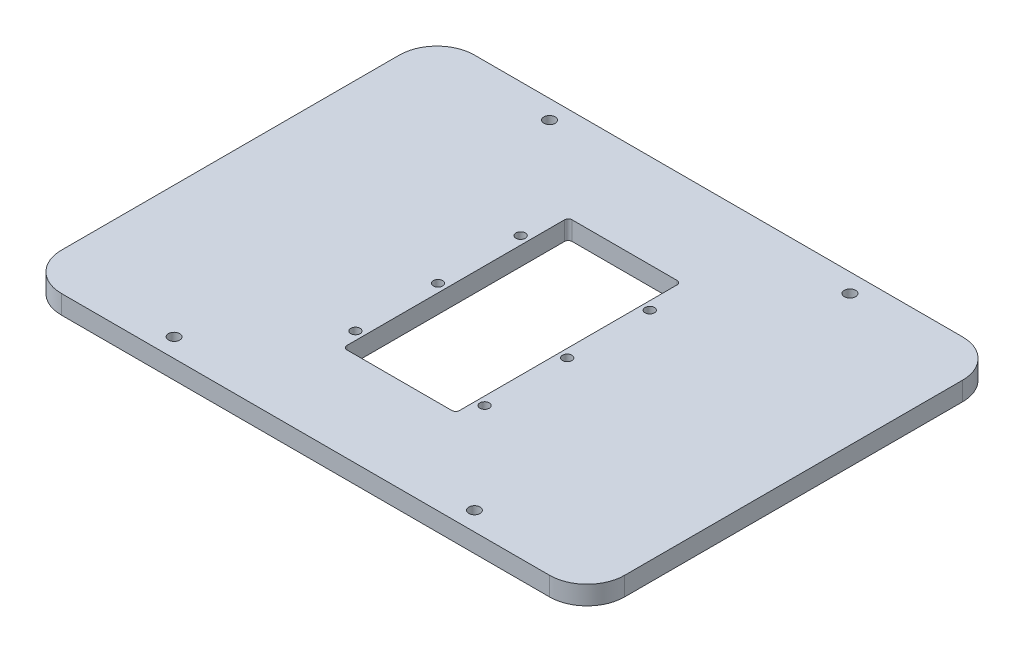
ISO-10303-21;
HEADER;
FILE_DESCRIPTION(('STEP AP214'),'2;1');
FILE_NAME('part.step','',(''),(''),'','','');
FILE_SCHEMA(('AUTOMOTIVE_DESIGN { 1 0 10303 214 1 1 1 1 }'));
ENDSEC;
DATA;
#1=APPLICATION_CONTEXT('core data for automotive mechanical design processes');
#2=APPLICATION_PROTOCOL_DEFINITION('international standard','automotive_design',2000,#1);
#3=PRODUCT_CONTEXT('',#1,'mechanical');
#4=PRODUCT('Part','Part','',(#3));
#5=PRODUCT_RELATED_PRODUCT_CATEGORY('part','',(#4));
#6=PRODUCT_DEFINITION_FORMATION('','',#4);
#7=PRODUCT_DEFINITION_CONTEXT('part definition',#1,'design');
#8=PRODUCT_DEFINITION('design','',#6,#7);
#9=PRODUCT_DEFINITION_SHAPE('','',#8);
#10=(LENGTH_UNIT() NAMED_UNIT(*) SI_UNIT(.MILLI.,.METRE.));
#11=(NAMED_UNIT(*) PLANE_ANGLE_UNIT() SI_UNIT($,.RADIAN.));
#12=(NAMED_UNIT(*) SI_UNIT($,.STERADIAN.) SOLID_ANGLE_UNIT());
#13=UNCERTAINTY_MEASURE_WITH_UNIT(LENGTH_MEASURE(1.E-05),#10,'distance_accuracy_value','');
#14=(GEOMETRIC_REPRESENTATION_CONTEXT(3) GLOBAL_UNCERTAINTY_ASSIGNED_CONTEXT((#13)) GLOBAL_UNIT_ASSIGNED_CONTEXT((#10,
#11,#12)) REPRESENTATION_CONTEXT('',''));
#15=CARTESIAN_POINT('',(0.,0.,0.));
#16=DIRECTION('',(0.,0.,1.));
#17=DIRECTION('',(1.,0.,0.));
#18=AXIS2_PLACEMENT_3D('',#15,#16,#17);
#19=CARTESIAN_POINT('',(65.,5.,45.));
#20=DIRECTION('',(0.,1.,0.));
#21=DIRECTION('',(0.,0.,1.));
#22=AXIS2_PLACEMENT_3D('',#19,#20,#21);
#23=PLANE('',#22);
#24=CARTESIAN_POINT('',(-17.2,5.,2.50000000000002));
#25=DIRECTION('',(0.,1.,0.));
#26=DIRECTION('',(0.,0.,-1.));
#27=AXIS2_PLACEMENT_3D('',#24,#25,#26);
#28=CIRCLE('',#27,1.24999999999999);
#29=CARTESIAN_POINT('',(-17.2,5.,1.25000000000003));
#30=VERTEX_POINT('',#29);
#31=EDGE_CURVE('E456',#30,#30,#28,.T.);
#32=ORIENTED_EDGE('',*,*,#31,.F.);
#33=EDGE_LOOP('',(#32));
#34=FACE_BOUND('',#33,.T.);
#35=CARTESIAN_POINT('',(17.2,5.,24.5));
#36=DIRECTION('',(0.,1.,0.));
#37=DIRECTION('',(0.,0.,1.));
#38=AXIS2_PLACEMENT_3D('',#35,#36,#37);
#39=CIRCLE('',#38,1.25);
#40=CARTESIAN_POINT('',(17.2,5.,25.75));
#41=VERTEX_POINT('',#40);
#42=EDGE_CURVE('E184',#41,#41,#39,.T.);
#43=ORIENTED_EDGE('',*,*,#42,.F.);
#44=EDGE_LOOP('',(#43));
#45=FACE_BOUND('',#44,.T.);
#46=CARTESIAN_POINT('',(17.2,5.,-19.5));
#47=DIRECTION('',(0.,1.,0.));
#48=DIRECTION('',(0.,0.,1.));
#49=AXIS2_PLACEMENT_3D('',#46,#47,#48);
#50=CIRCLE('',#49,1.25);
#51=CARTESIAN_POINT('',(17.2,5.,-18.25));
#52=VERTEX_POINT('',#51);
#53=EDGE_CURVE('E220',#52,#52,#50,.T.);
#54=ORIENTED_EDGE('',*,*,#53,.F.);
#55=EDGE_LOOP('',(#54));
#56=FACE_BOUND('',#55,.T.);
#57=CARTESIAN_POINT('',(40.,5.,-50.));
#58=DIRECTION('',(0.,1.,0.));
#59=DIRECTION('',(0.,0.,-1.));
#60=AXIS2_PLACEMENT_3D('',#57,#58,#59);
#61=CIRCLE('',#60,1.5);
#62=CARTESIAN_POINT('',(40.,5.,-51.5));
#63=VERTEX_POINT('',#62);
#64=EDGE_CURVE('E232',#63,#63,#61,.T.);
#65=ORIENTED_EDGE('',*,*,#64,.F.);
#66=EDGE_LOOP('',(#65));
#67=FACE_BOUND('',#66,.T.);
#68=CARTESIAN_POINT('',(-40.,5.,50.));
#69=DIRECTION('',(0.,1.,0.));
#70=DIRECTION('',(0.,0.,1.));
#71=AXIS2_PLACEMENT_3D('',#68,#69,#70);
#72=CIRCLE('',#71,1.5);
#73=CARTESIAN_POINT('',(-40.,5.,51.5));
#74=VERTEX_POINT('',#73);
#75=EDGE_CURVE('E244',#74,#74,#72,.T.);
#76=ORIENTED_EDGE('',*,*,#75,.F.);
#77=EDGE_LOOP('',(#76));
#78=FACE_BOUND('',#77,.T.);
#79=CARTESIAN_POINT('',(65.,5.,45.));
#80=DIRECTION('',(0.,1.,0.));
#81=DIRECTION('',(0.,0.,1.));
#82=AXIS2_PLACEMENT_3D('',#79,#80,#81);
#83=CIRCLE('',#82,9.99999999999999);
#84=CARTESIAN_POINT('',(65.,5.,55.));
#85=VERTEX_POINT('',#84);
#86=CARTESIAN_POINT('',(74.9999999999999,5.,45.));
#87=VERTEX_POINT('',#86);
#88=EDGE_CURVE('E250',#85,#87,#83,.T.);
#89=ORIENTED_EDGE('',*,*,#88,.T.);
#90=DIRECTION('',(0.,0.,-1.));
#91=VECTOR('',#90,1.);
#92=CARTESIAN_POINT('',(74.9999999999999,5.,45.));
#93=LINE('',#92,#91);
#94=CARTESIAN_POINT('',(75.,5.,-45.));
#95=VERTEX_POINT('',#94);
#96=EDGE_CURVE('E253',#87,#95,#93,.T.);
#97=ORIENTED_EDGE('',*,*,#96,.T.);
#98=CARTESIAN_POINT('',(65.,5.,-45.));
#99=DIRECTION('',(0.,1.,0.));
#100=DIRECTION('',(0.,0.,1.));
#101=AXIS2_PLACEMENT_3D('',#98,#99,#100);
#102=CIRCLE('',#101,9.99999999999999);
#103=CARTESIAN_POINT('',(65.,5.,-55.));
#104=VERTEX_POINT('',#103);
#105=EDGE_CURVE('E256',#95,#104,#102,.T.);
#106=ORIENTED_EDGE('',*,*,#105,.T.);
#107=DIRECTION('',(-1.,0.,0.));
#108=VECTOR('',#107,1.);
#109=CARTESIAN_POINT('',(65.,5.,-55.));
#110=LINE('',#109,#108);
#111=CARTESIAN_POINT('',(-65.0000000000002,5.,-55.));
#112=VERTEX_POINT('',#111);
#113=EDGE_CURVE('E258',#104,#112,#110,.T.);
#114=ORIENTED_EDGE('',*,*,#113,.T.);
#115=CARTESIAN_POINT('',(-65.0000000000002,5.,-45.));
#116=DIRECTION('',(0.,1.,0.));
#117=DIRECTION('',(0.,0.,1.));
#118=AXIS2_PLACEMENT_3D('',#115,#116,#117);
#119=CIRCLE('',#118,10.);
#120=CARTESIAN_POINT('',(-75.0000000000002,5.,-45.));
#121=VERTEX_POINT('',#120);
#122=EDGE_CURVE('E260',#112,#121,#119,.T.);
#123=ORIENTED_EDGE('',*,*,#122,.T.);
#124=DIRECTION('',(0.,0.,1.));
#125=VECTOR('',#124,1.);
#126=CARTESIAN_POINT('',(-75.0000000000002,5.,45.));
#127=LINE('',#126,#125);
#128=CARTESIAN_POINT('',(-75.0000000000002,5.,45.));
#129=VERTEX_POINT('',#128);
#130=EDGE_CURVE('E262',#121,#129,#127,.T.);
#131=ORIENTED_EDGE('',*,*,#130,.T.);
#132=CARTESIAN_POINT('',(-65.0000000000002,5.,45.));
#133=DIRECTION('',(0.,1.,0.));
#134=DIRECTION('',(0.,0.,-1.));
#135=AXIS2_PLACEMENT_3D('',#132,#133,#134);
#136=CIRCLE('',#135,10.);
#137=CARTESIAN_POINT('',(-65.0000000000002,5.,55.));
#138=VERTEX_POINT('',#137);
#139=EDGE_CURVE('E264',#129,#138,#136,.T.);
#140=ORIENTED_EDGE('',*,*,#139,.T.);
#141=DIRECTION('',(1.,0.,0.));
#142=VECTOR('',#141,1.);
#143=CARTESIAN_POINT('',(65.,5.,55.));
#144=LINE('',#143,#142);
#145=EDGE_CURVE('E266',#138,#85,#144,.T.);
#146=ORIENTED_EDGE('',*,*,#145,.T.);
#147=EDGE_LOOP('',(#89,#97,#106,#114,#123,#131,#140,#146));
#148=FACE_BOUND('',#147,.T.);
#149=CARTESIAN_POINT('',(40.,5.,50.));
#150=DIRECTION('',(0.,1.,0.));
#151=DIRECTION('',(0.,0.,1.));
#152=AXIS2_PLACEMENT_3D('',#149,#150,#151);
#153=CIRCLE('',#152,1.5);
#154=CARTESIAN_POINT('',(40.,5.,51.5));
#155=VERTEX_POINT('',#154);
#156=EDGE_CURVE('E238',#155,#155,#153,.T.);
#157=ORIENTED_EDGE('',*,*,#156,.F.);
#158=EDGE_LOOP('',(#157));
#159=FACE_BOUND('',#158,.T.);
#160=CARTESIAN_POINT('',(-40.,5.,-50.));
#161=DIRECTION('',(0.,1.,0.));
#162=DIRECTION('',(0.,0.,-1.));
#163=AXIS2_PLACEMENT_3D('',#160,#161,#162);
#164=CIRCLE('',#163,1.5);
#165=CARTESIAN_POINT('',(-40.,5.,-51.5));
#166=VERTEX_POINT('',#165);
#167=EDGE_CURVE('E226',#166,#166,#164,.T.);
#168=ORIENTED_EDGE('',*,*,#167,.F.);
#169=EDGE_LOOP('',(#168));
#170=FACE_BOUND('',#169,.T.);
#171=CARTESIAN_POINT('',(17.2,5.,2.50000000000002));
#172=DIRECTION('',(0.,1.,0.));
#173=DIRECTION('',(0.,0.,1.));
#174=AXIS2_PLACEMENT_3D('',#171,#172,#173);
#175=CIRCLE('',#174,1.25);
#176=CARTESIAN_POINT('',(17.2,5.,3.75000000000002));
#177=VERTEX_POINT('',#176);
#178=EDGE_CURVE('E214',#177,#177,#175,.T.);
#179=ORIENTED_EDGE('',*,*,#178,.F.);
#180=EDGE_LOOP('',(#179));
#181=FACE_BOUND('',#180,.T.);
#182=DIRECTION('',(0.,0.,-1.));
#183=VECTOR('',#182,1.);
#184=CARTESIAN_POINT('',(15.,5.,-29.));
#185=LINE('',#184,#183);
#186=CARTESIAN_POINT('',(15.,5.,29.));
#187=VERTEX_POINT('',#186);
#188=CARTESIAN_POINT('',(15.,5.,-29.));
#189=VERTEX_POINT('',#188);
#190=EDGE_CURVE('E154',#187,#189,#185,.T.);
#191=ORIENTED_EDGE('',*,*,#190,.F.);
#192=CARTESIAN_POINT('',(14.,5.,29.));
#193=DIRECTION('',(0.,1.,0.));
#194=DIRECTION('',(0.,0.,-1.));
#195=AXIS2_PLACEMENT_3D('',#192,#193,#194);
#196=CIRCLE('',#195,0.999999999999999);
#197=CARTESIAN_POINT('',(14.,5.,30.));
#198=VERTEX_POINT('',#197);
#199=EDGE_CURVE('E146',#198,#187,#196,.T.);
#200=ORIENTED_EDGE('',*,*,#199,.F.);
#201=DIRECTION('',(1.,0.,0.));
#202=VECTOR('',#201,1.);
#203=CARTESIAN_POINT('',(14.,5.,30.));
#204=LINE('',#203,#202);
#205=CARTESIAN_POINT('',(-14.,5.,30.));
#206=VERTEX_POINT('',#205);
#207=EDGE_CURVE('E181',#206,#198,#204,.T.);
#208=ORIENTED_EDGE('',*,*,#207,.F.);
#209=CARTESIAN_POINT('',(-14.,5.,29.));
#210=DIRECTION('',(0.,1.,0.));
#211=DIRECTION('',(0.,0.,-1.));
#212=AXIS2_PLACEMENT_3D('',#209,#210,#211);
#213=CIRCLE('',#212,0.999999999999999);
#214=CARTESIAN_POINT('',(-15.,5.,29.));
#215=VERTEX_POINT('',#214);
#216=EDGE_CURVE('E179',#215,#206,#213,.T.);
#217=ORIENTED_EDGE('',*,*,#216,.F.);
#218=DIRECTION('',(0.,0.,1.));
#219=VECTOR('',#218,1.);
#220=CARTESIAN_POINT('',(-15.,5.,-29.));
#221=LINE('',#220,#219);
#222=CARTESIAN_POINT('',(-15.,5.,-29.));
#223=VERTEX_POINT('',#222);
#224=EDGE_CURVE('E177',#223,#215,#221,.T.);
#225=ORIENTED_EDGE('',*,*,#224,.F.);
#226=CARTESIAN_POINT('',(-14.,5.,-29.));
#227=DIRECTION('',(0.,1.,0.));
#228=DIRECTION('',(0.,0.,1.));
#229=AXIS2_PLACEMENT_3D('',#226,#227,#228);
#230=CIRCLE('',#229,0.999999999999997);
#231=CARTESIAN_POINT('',(-14.,5.,-30.));
#232=VERTEX_POINT('',#231);
#233=EDGE_CURVE('E175',#232,#223,#230,.T.);
#234=ORIENTED_EDGE('',*,*,#233,.F.);
#235=DIRECTION('',(-1.,0.,0.));
#236=VECTOR('',#235,1.);
#237=CARTESIAN_POINT('',(14.,5.,-30.));
#238=LINE('',#237,#236);
#239=CARTESIAN_POINT('',(14.,5.,-30.));
#240=VERTEX_POINT('',#239);
#241=EDGE_CURVE('E170',#240,#232,#238,.T.);
#242=ORIENTED_EDGE('',*,*,#241,.F.);
#243=CARTESIAN_POINT('',(14.,5.,-29.));
#244=DIRECTION('',(0.,1.,0.));
#245=DIRECTION('',(0.,0.,-1.));
#246=AXIS2_PLACEMENT_3D('',#243,#244,#245);
#247=CIRCLE('',#246,0.999999999999997);
#248=EDGE_CURVE('E168',#189,#240,#247,.T.);
#249=ORIENTED_EDGE('',*,*,#248,.F.);
#250=EDGE_LOOP('',(#191,#200,#208,#217,#225,#234,#242,#249));
#251=FACE_BOUND('',#250,.T.);
#252=CARTESIAN_POINT('',(-17.2,5.,24.5));
#253=DIRECTION('',(0.,1.,0.));
#254=DIRECTION('',(0.,0.,-1.));
#255=AXIS2_PLACEMENT_3D('',#252,#253,#254);
#256=CIRCLE('',#255,1.24999999999999);
#257=CARTESIAN_POINT('',(-17.2,5.,23.25));
#258=VERTEX_POINT('',#257);
#259=EDGE_CURVE('E462',#258,#258,#256,.T.);
#260=ORIENTED_EDGE('',*,*,#259,.F.);
#261=EDGE_LOOP('',(#260));
#262=FACE_BOUND('',#261,.T.);
#263=CARTESIAN_POINT('',(-17.2,5.,-19.5));
#264=DIRECTION('',(0.,1.,0.));
#265=DIRECTION('',(0.,0.,-1.));
#266=AXIS2_PLACEMENT_3D('',#263,#264,#265);
#267=CIRCLE('',#266,1.24999999999999);
#268=CARTESIAN_POINT('',(-17.2,5.,-20.75));
#269=VERTEX_POINT('',#268);
#270=EDGE_CURVE('E447',#269,#269,#267,.T.);
#271=ORIENTED_EDGE('',*,*,#270,.F.);
#272=EDGE_LOOP('',(#271));
#273=FACE_BOUND('',#272,.T.);
#274=ADVANCED_FACE('F33',(#34,#45,#56,#67,#78,#148,#159,#170,#181,#251,#262,#273),#23,.T.);
#275=CARTESIAN_POINT('',(65.,0.,45.));
#276=DIRECTION('',(0.,1.,0.));
#277=DIRECTION('',(0.,0.,1.));
#278=AXIS2_PLACEMENT_3D('',#275,#276,#277);
#279=PLANE('',#278);
#280=CARTESIAN_POINT('',(17.2,0.,2.50000000000002));
#281=DIRECTION('',(0.,1.,0.));
#282=DIRECTION('',(0.,0.,1.));
#283=AXIS2_PLACEMENT_3D('',#280,#281,#282);
#284=CIRCLE('',#283,1.25);
#285=CARTESIAN_POINT('',(17.2,0.,3.75000000000002));
#286=VERTEX_POINT('',#285);
#287=EDGE_CURVE('E162',#286,#286,#284,.T.);
#288=ORIENTED_EDGE('',*,*,#287,.T.);
#289=EDGE_LOOP('',(#288));
#290=FACE_BOUND('',#289,.T.);
#291=CARTESIAN_POINT('',(17.2,0.,-19.5));
#292=DIRECTION('',(0.,1.,0.));
#293=DIRECTION('',(0.,0.,1.));
#294=AXIS2_PLACEMENT_3D('',#291,#292,#293);
#295=CIRCLE('',#294,1.25);
#296=CARTESIAN_POINT('',(17.2,0.,-18.25));
#297=VERTEX_POINT('',#296);
#298=EDGE_CURVE('E217',#297,#297,#295,.T.);
#299=ORIENTED_EDGE('',*,*,#298,.T.);
#300=EDGE_LOOP('',(#299));
#301=FACE_BOUND('',#300,.T.);
#302=CARTESIAN_POINT('',(-40.,0.,-50.));
#303=DIRECTION('',(0.,1.,0.));
#304=DIRECTION('',(0.,0.,-1.));
#305=AXIS2_PLACEMENT_3D('',#302,#303,#304);
#306=CIRCLE('',#305,1.5);
#307=CARTESIAN_POINT('',(-40.,0.,-51.5));
#308=VERTEX_POINT('',#307);
#309=EDGE_CURVE('E223',#308,#308,#306,.T.);
#310=ORIENTED_EDGE('',*,*,#309,.T.);
#311=EDGE_LOOP('',(#310));
#312=FACE_BOUND('',#311,.T.);
#313=CARTESIAN_POINT('',(40.,0.,-50.));
#314=DIRECTION('',(0.,1.,0.));
#315=DIRECTION('',(0.,0.,-1.));
#316=AXIS2_PLACEMENT_3D('',#313,#314,#315);
#317=CIRCLE('',#316,1.5);
#318=CARTESIAN_POINT('',(40.,0.,-51.5));
#319=VERTEX_POINT('',#318);
#320=EDGE_CURVE('E229',#319,#319,#317,.T.);
#321=ORIENTED_EDGE('',*,*,#320,.T.);
#322=EDGE_LOOP('',(#321));
#323=FACE_BOUND('',#322,.T.);
#324=CARTESIAN_POINT('',(40.,0.,50.));
#325=DIRECTION('',(0.,1.,0.));
#326=DIRECTION('',(0.,0.,1.));
#327=AXIS2_PLACEMENT_3D('',#324,#325,#326);
#328=CIRCLE('',#327,1.5);
#329=CARTESIAN_POINT('',(40.,0.,51.5));
#330=VERTEX_POINT('',#329);
#331=EDGE_CURVE('E235',#330,#330,#328,.T.);
#332=ORIENTED_EDGE('',*,*,#331,.T.);
#333=EDGE_LOOP('',(#332));
#334=FACE_BOUND('',#333,.T.);
#335=CARTESIAN_POINT('',(-40.,0.,50.));
#336=DIRECTION('',(0.,1.,0.));
#337=DIRECTION('',(0.,0.,1.));
#338=AXIS2_PLACEMENT_3D('',#335,#336,#337);
#339=CIRCLE('',#338,1.5);
#340=CARTESIAN_POINT('',(-40.,0.,51.5));
#341=VERTEX_POINT('',#340);
#342=EDGE_CURVE('E241',#341,#341,#339,.T.);
#343=ORIENTED_EDGE('',*,*,#342,.T.);
#344=EDGE_LOOP('',(#343));
#345=FACE_BOUND('',#344,.T.);
#346=CARTESIAN_POINT('',(65.,0.,45.));
#347=DIRECTION('',(0.,1.,0.));
#348=DIRECTION('',(0.,0.,1.));
#349=AXIS2_PLACEMENT_3D('',#346,#347,#348);
#350=CIRCLE('',#349,9.99999999999999);
#351=CARTESIAN_POINT('',(65.,0.,55.));
#352=VERTEX_POINT('',#351);
#353=CARTESIAN_POINT('',(74.9999999999999,0.,45.));
#354=VERTEX_POINT('',#353);
#355=EDGE_CURVE('E247',#352,#354,#350,.T.);
#356=ORIENTED_EDGE('',*,*,#355,.F.);
#357=DIRECTION('',(1.,0.,0.));
#358=VECTOR('',#357,1.);
#359=CARTESIAN_POINT('',(65.,0.,55.));
#360=LINE('',#359,#358);
#361=CARTESIAN_POINT('',(-65.0000000000002,0.,55.));
#362=VERTEX_POINT('',#361);
#363=EDGE_CURVE('E254',#362,#352,#360,.T.);
#364=ORIENTED_EDGE('',*,*,#363,.F.);
#365=CARTESIAN_POINT('',(-65.0000000000002,0.,45.));
#366=DIRECTION('',(0.,1.,0.));
#367=DIRECTION('',(0.,0.,-1.));
#368=AXIS2_PLACEMENT_3D('',#365,#366,#367);
#369=CIRCLE('',#368,10.);
#370=CARTESIAN_POINT('',(-75.0000000000002,0.,45.));
#371=VERTEX_POINT('',#370);
#372=EDGE_CURVE('E281',#371,#362,#369,.T.);
#373=ORIENTED_EDGE('',*,*,#372,.F.);
#374=DIRECTION('',(0.,0.,1.));
#375=VECTOR('',#374,1.);
#376=CARTESIAN_POINT('',(-75.0000000000002,0.,45.));
#377=LINE('',#376,#375);
#378=CARTESIAN_POINT('',(-75.0000000000002,0.,-45.));
#379=VERTEX_POINT('',#378);
#380=EDGE_CURVE('E279',#379,#371,#377,.T.);
#381=ORIENTED_EDGE('',*,*,#380,.F.);
#382=CARTESIAN_POINT('',(-65.0000000000002,0.,-45.));
#383=DIRECTION('',(0.,1.,0.));
#384=DIRECTION('',(0.,0.,1.));
#385=AXIS2_PLACEMENT_3D('',#382,#383,#384);
#386=CIRCLE('',#385,10.);
#387=CARTESIAN_POINT('',(-65.0000000000002,0.,-55.));
#388=VERTEX_POINT('',#387);
#389=EDGE_CURVE('E277',#388,#379,#386,.T.);
#390=ORIENTED_EDGE('',*,*,#389,.F.);
#391=DIRECTION('',(-1.,0.,0.));
#392=VECTOR('',#391,1.);
#393=CARTESIAN_POINT('',(65.,0.,-55.));
#394=LINE('',#393,#392);
#395=CARTESIAN_POINT('',(65.,0.,-55.));
#396=VERTEX_POINT('',#395);
#397=EDGE_CURVE('E275',#396,#388,#394,.T.);
#398=ORIENTED_EDGE('',*,*,#397,.F.);
#399=CARTESIAN_POINT('',(65.,0.,-45.));
#400=DIRECTION('',(0.,1.,0.));
#401=DIRECTION('',(0.,0.,1.));
#402=AXIS2_PLACEMENT_3D('',#399,#400,#401);
#403=CIRCLE('',#402,9.99999999999999);
#404=CARTESIAN_POINT('',(75.,0.,-45.));
#405=VERTEX_POINT('',#404);
#406=EDGE_CURVE('E273',#405,#396,#403,.T.);
#407=ORIENTED_EDGE('',*,*,#406,.F.);
#408=DIRECTION('',(0.,0.,-1.));
#409=VECTOR('',#408,1.);
#410=CARTESIAN_POINT('',(74.9999999999999,0.,45.));
#411=LINE('',#410,#409);
#412=EDGE_CURVE('E271',#354,#405,#411,.T.);
#413=ORIENTED_EDGE('',*,*,#412,.F.);
#414=EDGE_LOOP('',(#356,#364,#373,#381,#390,#398,#407,#413));
#415=FACE_BOUND('',#414,.T.);
#416=CARTESIAN_POINT('',(14.,0.,29.));
#417=DIRECTION('',(0.,1.,0.));
#418=DIRECTION('',(0.,0.,-1.));
#419=AXIS2_PLACEMENT_3D('',#416,#417,#418);
#420=CIRCLE('',#419,0.999999999999999);
#421=CARTESIAN_POINT('',(14.,0.,30.));
#422=VERTEX_POINT('',#421);
#423=CARTESIAN_POINT('',(15.,0.,29.));
#424=VERTEX_POINT('',#423);
#425=EDGE_CURVE('E56',#422,#424,#420,.T.);
#426=ORIENTED_EDGE('',*,*,#425,.T.);
#427=DIRECTION('',(0.,0.,-1.));
#428=VECTOR('',#427,1.);
#429=CARTESIAN_POINT('',(15.,0.,-29.));
#430=LINE('',#429,#428);
#431=CARTESIAN_POINT('',(15.,0.,-29.));
#432=VERTEX_POINT('',#431);
#433=EDGE_CURVE('E161',#424,#432,#430,.T.);
#434=ORIENTED_EDGE('',*,*,#433,.T.);
#435=CARTESIAN_POINT('',(14.,0.,-29.));
#436=DIRECTION('',(0.,1.,0.));
#437=DIRECTION('',(0.,0.,-1.));
#438=AXIS2_PLACEMENT_3D('',#435,#436,#437);
#439=CIRCLE('',#438,0.999999999999997);
#440=CARTESIAN_POINT('',(14.,0.,-30.));
#441=VERTEX_POINT('',#440);
#442=EDGE_CURVE('E186',#432,#441,#439,.T.);
#443=ORIENTED_EDGE('',*,*,#442,.T.);
#444=DIRECTION('',(-1.,0.,0.));
#445=VECTOR('',#444,1.);
#446=CARTESIAN_POINT('',(14.,0.,-30.));
#447=LINE('',#446,#445);
#448=CARTESIAN_POINT('',(-14.,0.,-30.));
#449=VERTEX_POINT('',#448);
#450=EDGE_CURVE('E189',#441,#449,#447,.T.);
#451=ORIENTED_EDGE('',*,*,#450,.T.);
#452=CARTESIAN_POINT('',(-14.,0.,-29.));
#453=DIRECTION('',(0.,1.,0.));
#454=DIRECTION('',(0.,0.,1.));
#455=AXIS2_PLACEMENT_3D('',#452,#453,#454);
#456=CIRCLE('',#455,0.999999999999997);
#457=CARTESIAN_POINT('',(-15.,0.,-29.));
#458=VERTEX_POINT('',#457);
#459=EDGE_CURVE('E192',#449,#458,#456,.T.);
#460=ORIENTED_EDGE('',*,*,#459,.T.);
#461=DIRECTION('',(0.,0.,1.));
#462=VECTOR('',#461,1.);
#463=CARTESIAN_POINT('',(-15.,0.,-29.));
#464=LINE('',#463,#462);
#465=CARTESIAN_POINT('',(-15.,0.,29.));
#466=VERTEX_POINT('',#465);
#467=EDGE_CURVE('E195',#458,#466,#464,.T.);
#468=ORIENTED_EDGE('',*,*,#467,.T.);
#469=CARTESIAN_POINT('',(-14.,0.,29.));
#470=DIRECTION('',(0.,1.,0.));
#471=DIRECTION('',(0.,0.,-1.));
#472=AXIS2_PLACEMENT_3D('',#469,#470,#471);
#473=CIRCLE('',#472,0.999999999999999);
#474=CARTESIAN_POINT('',(-14.,0.,30.));
#475=VERTEX_POINT('',#474);
#476=EDGE_CURVE('E198',#466,#475,#473,.T.);
#477=ORIENTED_EDGE('',*,*,#476,.T.);
#478=DIRECTION('',(1.,0.,0.));
#479=VECTOR('',#478,1.);
#480=CARTESIAN_POINT('',(14.,0.,30.));
#481=LINE('',#480,#479);
#482=EDGE_CURVE('E155',#475,#422,#481,.T.);
#483=ORIENTED_EDGE('',*,*,#482,.T.);
#484=EDGE_LOOP('',(#426,#434,#443,#451,#460,#468,#477,#483));
#485=FACE_BOUND('',#484,.T.);
#486=CARTESIAN_POINT('',(17.2,0.,24.5));
#487=DIRECTION('',(0.,1.,0.));
#488=DIRECTION('',(0.,0.,1.));
#489=AXIS2_PLACEMENT_3D('',#486,#487,#488);
#490=CIRCLE('',#489,1.25);
#491=CARTESIAN_POINT('',(17.2,0.,25.75));
#492=VERTEX_POINT('',#491);
#493=EDGE_CURVE('E465',#492,#492,#490,.T.);
#494=ORIENTED_EDGE('',*,*,#493,.T.);
#495=EDGE_LOOP('',(#494));
#496=FACE_BOUND('',#495,.T.);
#497=CARTESIAN_POINT('',(-17.2,0.,24.5));
#498=DIRECTION('',(0.,1.,0.));
#499=DIRECTION('',(0.,0.,-1.));
#500=AXIS2_PLACEMENT_3D('',#497,#498,#499);
#501=CIRCLE('',#500,1.24999999999999);
#502=CARTESIAN_POINT('',(-17.2,0.,23.25));
#503=VERTEX_POINT('',#502);
#504=EDGE_CURVE('E459',#503,#503,#501,.T.);
#505=ORIENTED_EDGE('',*,*,#504,.T.);
#506=EDGE_LOOP('',(#505));
#507=FACE_BOUND('',#506,.T.);
#508=CARTESIAN_POINT('',(-17.2,0.,2.50000000000002));
#509=DIRECTION('',(0.,1.,0.));
#510=DIRECTION('',(0.,0.,-1.));
#511=AXIS2_PLACEMENT_3D('',#508,#509,#510);
#512=CIRCLE('',#511,1.24999999999999);
#513=CARTESIAN_POINT('',(-17.2,0.,1.25000000000003));
#514=VERTEX_POINT('',#513);
#515=EDGE_CURVE('E453',#514,#514,#512,.T.);
#516=ORIENTED_EDGE('',*,*,#515,.T.);
#517=EDGE_LOOP('',(#516));
#518=FACE_BOUND('',#517,.T.);
#519=CARTESIAN_POINT('',(-17.2,0.,-19.5));
#520=DIRECTION('',(0.,1.,0.));
#521=DIRECTION('',(0.,0.,-1.));
#522=AXIS2_PLACEMENT_3D('',#519,#520,#521);
#523=CIRCLE('',#522,1.24999999999999);
#524=CARTESIAN_POINT('',(-17.2,0.,-20.75));
#525=VERTEX_POINT('',#524);
#526=EDGE_CURVE('E450',#525,#525,#523,.T.);
#527=ORIENTED_EDGE('',*,*,#526,.T.);
#528=EDGE_LOOP('',(#527));
#529=FACE_BOUND('',#528,.T.);
#530=ADVANCED_FACE('F311',(#290,#301,#312,#323,#334,#345,#415,#485,#496,#507,#518,#529),#279,.F.);
#531=CARTESIAN_POINT('',(65.,5.,45.));
#532=DIRECTION('',(0.,-1.,0.));
#533=DIRECTION('',(0.,0.,-1.));
#534=AXIS2_PLACEMENT_3D('',#531,#532,#533);
#535=CYLINDRICAL_SURFACE('',#534,9.99999999999999);
#536=ORIENTED_EDGE('',*,*,#355,.T.);
#537=DIRECTION('',(0.,-1.,0.));
#538=VECTOR('',#537,1.);
#539=CARTESIAN_POINT('',(74.9999999999999,5.,45.));
#540=LINE('',#539,#538);
#541=EDGE_CURVE('E11',#87,#354,#540,.T.);
#542=ORIENTED_EDGE('',*,*,#541,.F.);
#543=ORIENTED_EDGE('',*,*,#88,.F.);
#544=DIRECTION('',(0.,-1.,0.));
#545=VECTOR('',#544,1.);
#546=CARTESIAN_POINT('',(65.,5.,55.));
#547=LINE('',#546,#545);
#548=EDGE_CURVE('E268',#85,#352,#547,.T.);
#549=ORIENTED_EDGE('',*,*,#548,.T.);
#550=EDGE_LOOP('',(#536,#542,#543,#549));
#551=FACE_BOUND('',#550,.T.);
#552=ADVANCED_FACE('F35',(#551),#535,.T.);
#553=CARTESIAN_POINT('',(74.9999999999999,5.,45.));
#554=DIRECTION('',(-1.,0.,0.));
#555=DIRECTION('',(0.,0.,1.));
#556=AXIS2_PLACEMENT_3D('',#553,#554,#555);
#557=PLANE('',#556);
#558=ORIENTED_EDGE('',*,*,#412,.T.);
#559=DIRECTION('',(0.,-1.,0.));
#560=VECTOR('',#559,1.);
#561=CARTESIAN_POINT('',(75.,5.,-45.));
#562=LINE('',#561,#560);
#563=EDGE_CURVE('E41',#95,#405,#562,.T.);
#564=ORIENTED_EDGE('',*,*,#563,.F.);
#565=ORIENTED_EDGE('',*,*,#96,.F.);
#566=ORIENTED_EDGE('',*,*,#541,.T.);
#567=EDGE_LOOP('',(#558,#564,#565,#566));
#568=FACE_BOUND('',#567,.T.);
#569=ADVANCED_FACE('F329',(#568),#557,.F.);
#570=CARTESIAN_POINT('',(65.,5.,-45.));
#571=DIRECTION('',(0.,-1.,0.));
#572=DIRECTION('',(0.,0.,-1.));
#573=AXIS2_PLACEMENT_3D('',#570,#571,#572);
#574=CYLINDRICAL_SURFACE('',#573,9.99999999999999);
#575=ORIENTED_EDGE('',*,*,#406,.T.);
#576=DIRECTION('',(0.,-1.,0.));
#577=VECTOR('',#576,1.);
#578=CARTESIAN_POINT('',(65.,5.,-55.));
#579=LINE('',#578,#577);
#580=EDGE_CURVE('E298',#104,#396,#579,.T.);
#581=ORIENTED_EDGE('',*,*,#580,.F.);
#582=ORIENTED_EDGE('',*,*,#105,.F.);
#583=ORIENTED_EDGE('',*,*,#563,.T.);
#584=EDGE_LOOP('',(#575,#581,#582,#583));
#585=FACE_BOUND('',#584,.T.);
#586=ADVANCED_FACE('F305',(#585),#574,.T.);
#587=CARTESIAN_POINT('',(65.,5.,-55.));
#588=DIRECTION('',(0.,0.,1.));
#589=DIRECTION('',(1.,0.,0.));
#590=AXIS2_PLACEMENT_3D('',#587,#588,#589);
#591=PLANE('',#590);
#592=ORIENTED_EDGE('',*,*,#397,.T.);
#593=DIRECTION('',(0.,-1.,0.));
#594=VECTOR('',#593,1.);
#595=CARTESIAN_POINT('',(-65.0000000000002,5.,-55.));
#596=LINE('',#595,#594);
#597=EDGE_CURVE('E295',#112,#388,#596,.T.);
#598=ORIENTED_EDGE('',*,*,#597,.F.);
#599=ORIENTED_EDGE('',*,*,#113,.F.);
#600=ORIENTED_EDGE('',*,*,#580,.T.);
#601=EDGE_LOOP('',(#592,#598,#599,#600));
#602=FACE_BOUND('',#601,.T.);
#603=ADVANCED_FACE('F317',(#602),#591,.F.);
#604=CARTESIAN_POINT('',(-65.0000000000002,5.,-45.));
#605=DIRECTION('',(0.,-1.,0.));
#606=DIRECTION('',(0.,0.,-1.));
#607=AXIS2_PLACEMENT_3D('',#604,#605,#606);
#608=CYLINDRICAL_SURFACE('',#607,10.);
#609=ORIENTED_EDGE('',*,*,#389,.T.);
#610=DIRECTION('',(0.,-1.,0.));
#611=VECTOR('',#610,1.);
#612=CARTESIAN_POINT('',(-75.0000000000002,5.,-45.));
#613=LINE('',#612,#611);
#614=EDGE_CURVE('E292',#121,#379,#613,.T.);
#615=ORIENTED_EDGE('',*,*,#614,.F.);
#616=ORIENTED_EDGE('',*,*,#122,.F.);
#617=ORIENTED_EDGE('',*,*,#597,.T.);
#618=EDGE_LOOP('',(#609,#615,#616,#617));
#619=FACE_BOUND('',#618,.T.);
#620=ADVANCED_FACE('F321',(#619),#608,.T.);
#621=CARTESIAN_POINT('',(-75.0000000000002,5.,45.));
#622=DIRECTION('',(1.,0.,0.));
#623=DIRECTION('',(0.,0.,-1.));
#624=AXIS2_PLACEMENT_3D('',#621,#622,#623);
#625=PLANE('',#624);
#626=ORIENTED_EDGE('',*,*,#380,.T.);
#627=DIRECTION('',(0.,-1.,0.));
#628=VECTOR('',#627,1.);
#629=CARTESIAN_POINT('',(-75.0000000000002,5.,45.));
#630=LINE('',#629,#628);
#631=EDGE_CURVE('E289',#129,#371,#630,.T.);
#632=ORIENTED_EDGE('',*,*,#631,.F.);
#633=ORIENTED_EDGE('',*,*,#130,.F.);
#634=ORIENTED_EDGE('',*,*,#614,.T.);
#635=EDGE_LOOP('',(#626,#632,#633,#634));
#636=FACE_BOUND('',#635,.T.);
#637=ADVANCED_FACE('F342',(#636),#625,.F.);
#638=CARTESIAN_POINT('',(-65.0000000000002,5.,45.));
#639=DIRECTION('',(0.,-1.,0.));
#640=DIRECTION('',(0.,0.,-1.));
#641=AXIS2_PLACEMENT_3D('',#638,#639,#640);
#642=CYLINDRICAL_SURFACE('',#641,10.);
#643=ORIENTED_EDGE('',*,*,#372,.T.);
#644=DIRECTION('',(0.,-1.,0.));
#645=VECTOR('',#644,1.);
#646=CARTESIAN_POINT('',(-65.0000000000002,5.,55.));
#647=LINE('',#646,#645);
#648=EDGE_CURVE('E286',#138,#362,#647,.T.);
#649=ORIENTED_EDGE('',*,*,#648,.F.);
#650=ORIENTED_EDGE('',*,*,#139,.F.);
#651=ORIENTED_EDGE('',*,*,#631,.T.);
#652=EDGE_LOOP('',(#643,#649,#650,#651));
#653=FACE_BOUND('',#652,.T.);
#654=ADVANCED_FACE('F340',(#653),#642,.T.);
#655=CARTESIAN_POINT('',(65.,5.,55.));
#656=DIRECTION('',(0.,0.,-1.));
#657=DIRECTION('',(-1.,0.,0.));
#658=AXIS2_PLACEMENT_3D('',#655,#656,#657);
#659=PLANE('',#658);
#660=ORIENTED_EDGE('',*,*,#363,.T.);
#661=ORIENTED_EDGE('',*,*,#548,.F.);
#662=ORIENTED_EDGE('',*,*,#145,.F.);
#663=ORIENTED_EDGE('',*,*,#648,.T.);
#664=EDGE_LOOP('',(#660,#661,#662,#663));
#665=FACE_BOUND('',#664,.T.);
#666=ADVANCED_FACE('F335',(#665),#659,.F.);
#667=CARTESIAN_POINT('',(-40.,5.,50.));
#668=DIRECTION('',(0.,-1.,0.));
#669=DIRECTION('',(0.,0.,-1.));
#670=AXIS2_PLACEMENT_3D('',#667,#668,#669);
#671=CYLINDRICAL_SURFACE('',#670,1.5);
#672=ORIENTED_EDGE('',*,*,#75,.T.);
#673=EDGE_LOOP('',(#672));
#674=FACE_BOUND('',#673,.T.);
#675=ORIENTED_EDGE('',*,*,#342,.F.);
#676=EDGE_LOOP('',(#675));
#677=FACE_BOUND('',#676,.T.);
#678=ADVANCED_FACE('F362',(#674,#677),#671,.F.);
#679=CARTESIAN_POINT('',(40.,5.,50.));
#680=DIRECTION('',(0.,-1.,0.));
#681=DIRECTION('',(0.,0.,-1.));
#682=AXIS2_PLACEMENT_3D('',#679,#680,#681);
#683=CYLINDRICAL_SURFACE('',#682,1.5);
#684=ORIENTED_EDGE('',*,*,#156,.T.);
#685=EDGE_LOOP('',(#684));
#686=FACE_BOUND('',#685,.T.);
#687=ORIENTED_EDGE('',*,*,#331,.F.);
#688=EDGE_LOOP('',(#687));
#689=FACE_BOUND('',#688,.T.);
#690=ADVANCED_FACE('F369',(#686,#689),#683,.F.);
#691=CARTESIAN_POINT('',(40.,5.,-50.));
#692=DIRECTION('',(0.,-1.,0.));
#693=DIRECTION('',(0.,0.,-1.));
#694=AXIS2_PLACEMENT_3D('',#691,#692,#693);
#695=CYLINDRICAL_SURFACE('',#694,1.5);
#696=ORIENTED_EDGE('',*,*,#64,.T.);
#697=EDGE_LOOP('',(#696));
#698=FACE_BOUND('',#697,.T.);
#699=ORIENTED_EDGE('',*,*,#320,.F.);
#700=EDGE_LOOP('',(#699));
#701=FACE_BOUND('',#700,.T.);
#702=ADVANCED_FACE('F374',(#698,#701),#695,.F.);
#703=CARTESIAN_POINT('',(-40.,5.,-50.));
#704=DIRECTION('',(0.,-1.,0.));
#705=DIRECTION('',(0.,0.,-1.));
#706=AXIS2_PLACEMENT_3D('',#703,#704,#705);
#707=CYLINDRICAL_SURFACE('',#706,1.5);
#708=ORIENTED_EDGE('',*,*,#167,.T.);
#709=EDGE_LOOP('',(#708));
#710=FACE_BOUND('',#709,.T.);
#711=ORIENTED_EDGE('',*,*,#309,.F.);
#712=EDGE_LOOP('',(#711));
#713=FACE_BOUND('',#712,.T.);
#714=ADVANCED_FACE('F384',(#710,#713),#707,.F.);
#715=CARTESIAN_POINT('',(17.2,5.,-19.5));
#716=DIRECTION('',(0.,-1.,0.));
#717=DIRECTION('',(0.,0.,-1.));
#718=AXIS2_PLACEMENT_3D('',#715,#716,#717);
#719=CYLINDRICAL_SURFACE('',#718,1.25);
#720=ORIENTED_EDGE('',*,*,#53,.T.);
#721=EDGE_LOOP('',(#720));
#722=FACE_BOUND('',#721,.T.);
#723=ORIENTED_EDGE('',*,*,#298,.F.);
#724=EDGE_LOOP('',(#723));
#725=FACE_BOUND('',#724,.T.);
#726=ADVANCED_FACE('F391',(#722,#725),#719,.F.);
#727=CARTESIAN_POINT('',(17.2,5.,2.50000000000002));
#728=DIRECTION('',(0.,-1.,0.));
#729=DIRECTION('',(0.,0.,-1.));
#730=AXIS2_PLACEMENT_3D('',#727,#728,#729);
#731=CYLINDRICAL_SURFACE('',#730,1.25);
#732=ORIENTED_EDGE('',*,*,#178,.T.);
#733=EDGE_LOOP('',(#732));
#734=FACE_BOUND('',#733,.T.);
#735=ORIENTED_EDGE('',*,*,#287,.F.);
#736=EDGE_LOOP('',(#735));
#737=FACE_BOUND('',#736,.T.);
#738=ADVANCED_FACE('F395',(#734,#737),#731,.F.);
#739=CARTESIAN_POINT('',(14.,5.,29.));
#740=DIRECTION('',(0.,-1.,0.));
#741=DIRECTION('',(0.,0.,-1.));
#742=AXIS2_PLACEMENT_3D('',#739,#740,#741);
#743=CYLINDRICAL_SURFACE('',#742,0.999999999999999);
#744=ORIENTED_EDGE('',*,*,#425,.F.);
#745=DIRECTION('',(0.,-1.,0.));
#746=VECTOR('',#745,1.);
#747=CARTESIAN_POINT('',(14.,5.,30.));
#748=LINE('',#747,#746);
#749=EDGE_CURVE('E150',#198,#422,#748,.T.);
#750=ORIENTED_EDGE('',*,*,#749,.F.);
#751=ORIENTED_EDGE('',*,*,#199,.T.);
#752=DIRECTION('',(0.,-1.,0.));
#753=VECTOR('',#752,1.);
#754=CARTESIAN_POINT('',(15.,5.,29.));
#755=LINE('',#754,#753);
#756=EDGE_CURVE('E149',#187,#424,#755,.T.);
#757=ORIENTED_EDGE('',*,*,#756,.T.);
#758=EDGE_LOOP('',(#744,#750,#751,#757));
#759=FACE_BOUND('',#758,.T.);
#760=ADVANCED_FACE('F148',(#759),#743,.F.);
#761=CARTESIAN_POINT('',(15.,5.,-29.));
#762=DIRECTION('',(-1.,0.,0.));
#763=DIRECTION('',(0.,0.,1.));
#764=AXIS2_PLACEMENT_3D('',#761,#762,#763);
#765=PLANE('',#764);
#766=ORIENTED_EDGE('',*,*,#433,.F.);
#767=ORIENTED_EDGE('',*,*,#756,.F.);
#768=ORIENTED_EDGE('',*,*,#190,.T.);
#769=DIRECTION('',(0.,-1.,0.));
#770=VECTOR('',#769,1.);
#771=CARTESIAN_POINT('',(15.,5.,-29.));
#772=LINE('',#771,#770);
#773=EDGE_CURVE('E163',#189,#432,#772,.T.);
#774=ORIENTED_EDGE('',*,*,#773,.T.);
#775=EDGE_LOOP('',(#766,#767,#768,#774));
#776=FACE_BOUND('',#775,.T.);
#777=ADVANCED_FACE('F158',(#776),#765,.T.);
#778=CARTESIAN_POINT('',(14.,5.,-29.));
#779=DIRECTION('',(0.,-1.,0.));
#780=DIRECTION('',(0.,0.,-1.));
#781=AXIS2_PLACEMENT_3D('',#778,#779,#780);
#782=CYLINDRICAL_SURFACE('',#781,0.999999999999997);
#783=ORIENTED_EDGE('',*,*,#442,.F.);
#784=ORIENTED_EDGE('',*,*,#773,.F.);
#785=ORIENTED_EDGE('',*,*,#248,.T.);
#786=DIRECTION('',(0.,-1.,0.));
#787=VECTOR('',#786,1.);
#788=CARTESIAN_POINT('',(14.,5.,-30.));
#789=LINE('',#788,#787);
#790=EDGE_CURVE('E211',#240,#441,#789,.T.);
#791=ORIENTED_EDGE('',*,*,#790,.T.);
#792=EDGE_LOOP('',(#783,#784,#785,#791));
#793=FACE_BOUND('',#792,.T.);
#794=ADVANCED_FACE('F404',(#793),#782,.F.);
#795=CARTESIAN_POINT('',(14.,5.,-30.));
#796=DIRECTION('',(0.,0.,1.));
#797=DIRECTION('',(1.,0.,0.));
#798=AXIS2_PLACEMENT_3D('',#795,#796,#797);
#799=PLANE('',#798);
#800=ORIENTED_EDGE('',*,*,#450,.F.);
#801=ORIENTED_EDGE('',*,*,#790,.F.);
#802=ORIENTED_EDGE('',*,*,#241,.T.);
#803=DIRECTION('',(0.,-1.,0.));
#804=VECTOR('',#803,1.);
#805=CARTESIAN_POINT('',(-14.,5.,-30.));
#806=LINE('',#805,#804);
#807=EDGE_CURVE('E209',#232,#449,#806,.T.);
#808=ORIENTED_EDGE('',*,*,#807,.T.);
#809=EDGE_LOOP('',(#800,#801,#802,#808));
#810=FACE_BOUND('',#809,.T.);
#811=ADVANCED_FACE('F407',(#810),#799,.T.);
#812=CARTESIAN_POINT('',(-14.,5.,-29.));
#813=DIRECTION('',(0.,-1.,0.));
#814=DIRECTION('',(0.,0.,-1.));
#815=AXIS2_PLACEMENT_3D('',#812,#813,#814);
#816=CYLINDRICAL_SURFACE('',#815,0.999999999999997);
#817=ORIENTED_EDGE('',*,*,#459,.F.);
#818=ORIENTED_EDGE('',*,*,#807,.F.);
#819=ORIENTED_EDGE('',*,*,#233,.T.);
#820=DIRECTION('',(0.,-1.,0.));
#821=VECTOR('',#820,1.);
#822=CARTESIAN_POINT('',(-15.,5.,-29.));
#823=LINE('',#822,#821);
#824=EDGE_CURVE('E207',#223,#458,#823,.T.);
#825=ORIENTED_EDGE('',*,*,#824,.T.);
#826=EDGE_LOOP('',(#817,#818,#819,#825));
#827=FACE_BOUND('',#826,.T.);
#828=ADVANCED_FACE('F411',(#827),#816,.F.);
#829=CARTESIAN_POINT('',(-15.,5.,-29.));
#830=DIRECTION('',(1.,0.,0.));
#831=DIRECTION('',(0.,0.,-1.));
#832=AXIS2_PLACEMENT_3D('',#829,#830,#831);
#833=PLANE('',#832);
#834=ORIENTED_EDGE('',*,*,#467,.F.);
#835=ORIENTED_EDGE('',*,*,#824,.F.);
#836=ORIENTED_EDGE('',*,*,#224,.T.);
#837=DIRECTION('',(0.,-1.,0.));
#838=VECTOR('',#837,1.);
#839=CARTESIAN_POINT('',(-15.,5.,29.));
#840=LINE('',#839,#838);
#841=EDGE_CURVE('E205',#215,#466,#840,.T.);
#842=ORIENTED_EDGE('',*,*,#841,.T.);
#843=EDGE_LOOP('',(#834,#835,#836,#842));
#844=FACE_BOUND('',#843,.T.);
#845=ADVANCED_FACE('F415',(#844),#833,.T.);
#846=CARTESIAN_POINT('',(-14.,5.,29.));
#847=DIRECTION('',(0.,-1.,0.));
#848=DIRECTION('',(0.,0.,-1.));
#849=AXIS2_PLACEMENT_3D('',#846,#847,#848);
#850=CYLINDRICAL_SURFACE('',#849,0.999999999999999);
#851=ORIENTED_EDGE('',*,*,#476,.F.);
#852=ORIENTED_EDGE('',*,*,#841,.F.);
#853=ORIENTED_EDGE('',*,*,#216,.T.);
#854=DIRECTION('',(0.,-1.,0.));
#855=VECTOR('',#854,1.);
#856=CARTESIAN_POINT('',(-14.,5.,30.));
#857=LINE('',#856,#855);
#858=EDGE_CURVE('E48',#206,#475,#857,.T.);
#859=ORIENTED_EDGE('',*,*,#858,.T.);
#860=EDGE_LOOP('',(#851,#852,#853,#859));
#861=FACE_BOUND('',#860,.T.);
#862=ADVANCED_FACE('F419',(#861),#850,.F.);
#863=CARTESIAN_POINT('',(14.,5.,30.));
#864=DIRECTION('',(0.,0.,-1.));
#865=DIRECTION('',(-1.,0.,0.));
#866=AXIS2_PLACEMENT_3D('',#863,#864,#865);
#867=PLANE('',#866);
#868=ORIENTED_EDGE('',*,*,#482,.F.);
#869=ORIENTED_EDGE('',*,*,#858,.F.);
#870=ORIENTED_EDGE('',*,*,#207,.T.);
#871=ORIENTED_EDGE('',*,*,#749,.T.);
#872=EDGE_LOOP('',(#868,#869,#870,#871));
#873=FACE_BOUND('',#872,.T.);
#874=ADVANCED_FACE('F423',(#873),#867,.T.);
#875=CARTESIAN_POINT('',(17.2,5.,24.5));
#876=DIRECTION('',(0.,-1.,0.));
#877=DIRECTION('',(0.,0.,-1.));
#878=AXIS2_PLACEMENT_3D('',#875,#876,#877);
#879=CYLINDRICAL_SURFACE('',#878,1.25);
#880=ORIENTED_EDGE('',*,*,#42,.T.);
#881=EDGE_LOOP('',(#880));
#882=FACE_BOUND('',#881,.T.);
#883=ORIENTED_EDGE('',*,*,#493,.F.);
#884=EDGE_LOOP('',(#883));
#885=FACE_BOUND('',#884,.T.);
#886=ADVANCED_FACE('F427',(#882,#885),#879,.F.);
#887=CARTESIAN_POINT('',(-17.2,5.,24.5));
#888=DIRECTION('',(0.,-1.,0.));
#889=DIRECTION('',(0.,0.,-1.));
#890=AXIS2_PLACEMENT_3D('',#887,#888,#889);
#891=CYLINDRICAL_SURFACE('',#890,1.24999999999999);
#892=ORIENTED_EDGE('',*,*,#259,.T.);
#893=EDGE_LOOP('',(#892));
#894=FACE_BOUND('',#893,.T.);
#895=ORIENTED_EDGE('',*,*,#504,.F.);
#896=EDGE_LOOP('',(#895));
#897=FACE_BOUND('',#896,.T.);
#898=ADVANCED_FACE('F430',(#894,#897),#891,.F.);
#899=CARTESIAN_POINT('',(-17.2,5.,2.50000000000002));
#900=DIRECTION('',(0.,-1.,0.));
#901=DIRECTION('',(0.,0.,-1.));
#902=AXIS2_PLACEMENT_3D('',#899,#900,#901);
#903=CYLINDRICAL_SURFACE('',#902,1.24999999999999);
#904=ORIENTED_EDGE('',*,*,#31,.T.);
#905=EDGE_LOOP('',(#904));
#906=FACE_BOUND('',#905,.T.);
#907=ORIENTED_EDGE('',*,*,#515,.F.);
#908=EDGE_LOOP('',(#907));
#909=FACE_BOUND('',#908,.T.);
#910=ADVANCED_FACE('F434',(#906,#909),#903,.F.);
#911=CARTESIAN_POINT('',(-17.2,5.,-19.5));
#912=DIRECTION('',(0.,-1.,0.));
#913=DIRECTION('',(0.,0.,-1.));
#914=AXIS2_PLACEMENT_3D('',#911,#912,#913);
#915=CYLINDRICAL_SURFACE('',#914,1.24999999999999);
#916=ORIENTED_EDGE('',*,*,#270,.T.);
#917=EDGE_LOOP('',(#916));
#918=FACE_BOUND('',#917,.T.);
#919=ORIENTED_EDGE('',*,*,#526,.F.);
#920=EDGE_LOOP('',(#919));
#921=FACE_BOUND('',#920,.T.);
#922=ADVANCED_FACE('F438',(#918,#921),#915,.F.);
#923=CLOSED_SHELL('',(#274,#530,#552,#569,#586,#603,#620,#637,#654,#666,#678,#690,#702,#714,
#726,#738,#760,#777,#794,#811,#828,#845,#862,#874,#886,#898,#910,#922));
#924=MANIFOLD_SOLID_BREP('B2',#923);
#925=ADVANCED_BREP_SHAPE_REPRESENTATION('',(#18,#924),#14);
#926=SHAPE_DEFINITION_REPRESENTATION(#9,#925);
ENDSEC;
END-ISO-10303-21;
